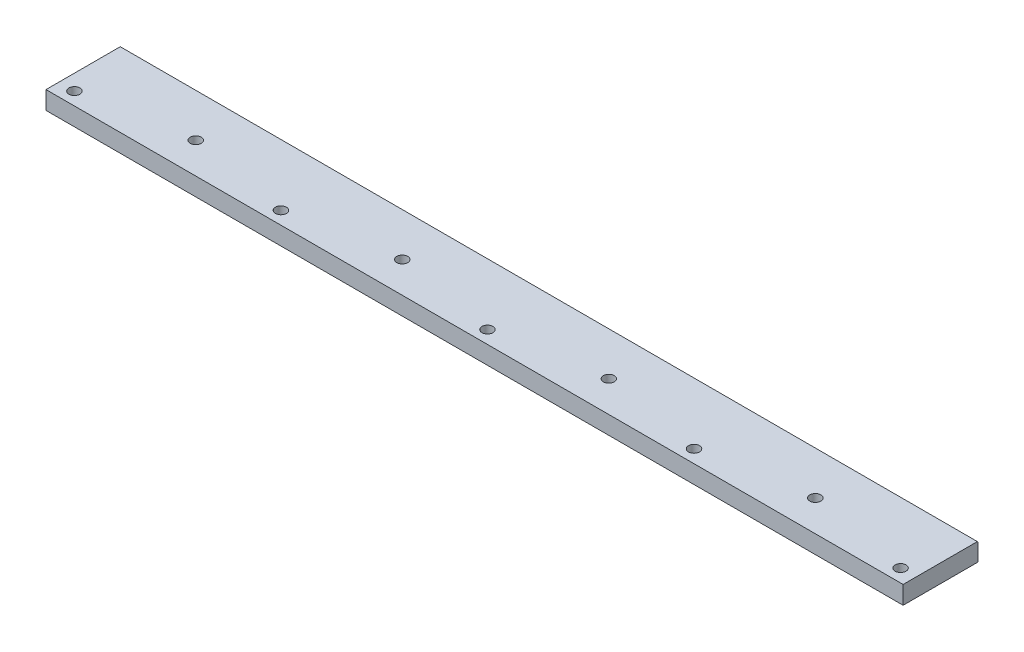
ISO-10303-21;
HEADER;
FILE_DESCRIPTION(('STEP AP214'),'2;1');
FILE_NAME('part.step','',(''),(''),'','','');
FILE_SCHEMA(('AUTOMOTIVE_DESIGN { 1 0 10303 214 1 1 1 1 }'));
ENDSEC;
DATA;
#1=APPLICATION_CONTEXT('core data for automotive mechanical design processes');
#2=APPLICATION_PROTOCOL_DEFINITION('international standard','automotive_design',2000,#1);
#3=PRODUCT_CONTEXT('',#1,'mechanical');
#4=PRODUCT('Part','Part','',(#3));
#5=PRODUCT_RELATED_PRODUCT_CATEGORY('part','',(#4));
#6=PRODUCT_DEFINITION_FORMATION('','',#4);
#7=PRODUCT_DEFINITION_CONTEXT('part definition',#1,'design');
#8=PRODUCT_DEFINITION('design','',#6,#7);
#9=PRODUCT_DEFINITION_SHAPE('','',#8);
#10=(LENGTH_UNIT() NAMED_UNIT(*) SI_UNIT(.MILLI.,.METRE.));
#11=(NAMED_UNIT(*) PLANE_ANGLE_UNIT() SI_UNIT($,.RADIAN.));
#12=(NAMED_UNIT(*) SI_UNIT($,.STERADIAN.) SOLID_ANGLE_UNIT());
#13=UNCERTAINTY_MEASURE_WITH_UNIT(LENGTH_MEASURE(1.E-05),#10,'distance_accuracy_value','');
#14=(GEOMETRIC_REPRESENTATION_CONTEXT(3) GLOBAL_UNCERTAINTY_ASSIGNED_CONTEXT((#13)) GLOBAL_UNIT_ASSIGNED_CONTEXT((#10,
#11,#12)) REPRESENTATION_CONTEXT('',''));
#15=CARTESIAN_POINT('',(0.,0.,0.));
#16=DIRECTION('',(0.,0.,1.));
#17=DIRECTION('',(1.,0.,0.));
#18=AXIS2_PLACEMENT_3D('',#15,#16,#17);
#19=CARTESIAN_POINT('',(1054.1,22.225,92.075));
#20=DIRECTION('',(-1.,0.,0.));
#21=DIRECTION('',(0.,0.,1.));
#22=AXIS2_PLACEMENT_3D('',#19,#20,#21);
#23=PLANE('',#22);
#24=DIRECTION('',(0.,-1.,0.));
#25=VECTOR('',#24,1.);
#26=CARTESIAN_POINT('',(1054.1,22.225,-92.075));
#27=LINE('',#26,#25);
#28=CARTESIAN_POINT('',(1054.1,20.7010000000001,-92.075));
#29=VERTEX_POINT('',#28);
#30=CARTESIAN_POINT('',(1054.1,-20.7010000000001,-92.075));
#31=VERTEX_POINT('',#30);
#32=EDGE_CURVE('E132',#29,#31,#27,.T.);
#33=ORIENTED_EDGE('',*,*,#32,.F.);
#34=DIRECTION('',(0.,-0.707106781186548,-0.707106781186548));
#35=VECTOR('',#34,1.);
#36=CARTESIAN_POINT('',(1054.1,22.225,-90.5510000000001));
#37=LINE('',#36,#35);
#38=CARTESIAN_POINT('',(1054.1,22.225,-90.5510000000001));
#39=VERTEX_POINT('',#38);
#40=EDGE_CURVE('E50',#29,#39,#37,.F.);
#41=ORIENTED_EDGE('',*,*,#40,.T.);
#42=DIRECTION('',(0.,0.,-1.));
#43=VECTOR('',#42,1.);
#44=CARTESIAN_POINT('',(1054.1,22.225,92.075));
#45=LINE('',#44,#43);
#46=CARTESIAN_POINT('',(1054.1,22.225,92.075));
#47=VERTEX_POINT('',#46);
#48=EDGE_CURVE('E106',#47,#39,#45,.T.);
#49=ORIENTED_EDGE('',*,*,#48,.F.);
#50=DIRECTION('',(0.,-1.,0.));
#51=VECTOR('',#50,1.);
#52=CARTESIAN_POINT('',(1054.1,22.225,92.075));
#53=LINE('',#52,#51);
#54=CARTESIAN_POINT('',(1054.1,-22.225,92.075));
#55=VERTEX_POINT('',#54);
#56=EDGE_CURVE('E115',#47,#55,#53,.T.);
#57=ORIENTED_EDGE('',*,*,#56,.T.);
#58=DIRECTION('',(0.,0.,-1.));
#59=VECTOR('',#58,1.);
#60=CARTESIAN_POINT('',(1054.1,-22.225,92.075));
#61=LINE('',#60,#59);
#62=CARTESIAN_POINT('',(1054.1,-22.225,-90.5510000000004));
#63=VERTEX_POINT('',#62);
#64=EDGE_CURVE('E124',#55,#63,#61,.T.);
#65=ORIENTED_EDGE('',*,*,#64,.T.);
#66=DIRECTION('',(0.,0.707106781186599,-0.707106781186496));
#67=VECTOR('',#66,1.);
#68=CARTESIAN_POINT('',(1054.1,-20.7010000000001,-92.075));
#69=LINE('',#68,#67);
#70=EDGE_CURVE('E62',#63,#31,#69,.T.);
#71=ORIENTED_EDGE('',*,*,#70,.T.);
#72=EDGE_LOOP('',(#33,#41,#49,#57,#65,#71));
#73=FACE_BOUND('',#72,.T.);
#74=ADVANCED_FACE('F41',(#73),#23,.F.);
#75=CARTESIAN_POINT('',(-1054.1,22.225,-92.075));
#76=DIRECTION('',(0.,0.,1.));
#77=DIRECTION('',(1.,0.,0.));
#78=AXIS2_PLACEMENT_3D('',#75,#76,#77);
#79=PLANE('',#78);
#80=DIRECTION('',(0.,-1.,0.));
#81=VECTOR('',#80,1.);
#82=CARTESIAN_POINT('',(-1054.1,22.225,-92.075));
#83=LINE('',#82,#81);
#84=CARTESIAN_POINT('',(-1054.1,20.7010000000001,-92.075));
#85=VERTEX_POINT('',#84);
#86=CARTESIAN_POINT('',(-1054.1,-20.7010000000001,-92.075));
#87=VERTEX_POINT('',#86);
#88=EDGE_CURVE('E114',#85,#87,#83,.T.);
#89=ORIENTED_EDGE('',*,*,#88,.F.);
#90=DIRECTION('',(1.,0.,0.));
#91=VECTOR('',#90,1.);
#92=CARTESIAN_POINT('',(-1054.1,20.7010000000001,-92.075));
#93=LINE('',#92,#91);
#94=EDGE_CURVE('E173',#85,#29,#93,.T.);
#95=ORIENTED_EDGE('',*,*,#94,.T.);
#96=ORIENTED_EDGE('',*,*,#32,.T.);
#97=DIRECTION('',(-1.,0.,0.));
#98=VECTOR('',#97,1.);
#99=CARTESIAN_POINT('',(-1054.1,-20.7010000000001,-92.075));
#100=LINE('',#99,#98);
#101=EDGE_CURVE('E170',#31,#87,#100,.T.);
#102=ORIENTED_EDGE('',*,*,#101,.T.);
#103=EDGE_LOOP('',(#89,#95,#96,#102));
#104=FACE_BOUND('',#103,.T.);
#105=ADVANCED_FACE('F181',(#104),#79,.F.);
#106=CARTESIAN_POINT('',(-1054.1,22.225,92.075));
#107=DIRECTION('',(1.,0.,0.));
#108=DIRECTION('',(0.,0.,-1.));
#109=AXIS2_PLACEMENT_3D('',#106,#107,#108);
#110=PLANE('',#109);
#111=DIRECTION('',(0.,0.,1.));
#112=VECTOR('',#111,1.);
#113=CARTESIAN_POINT('',(-1054.1,22.225,92.075));
#114=LINE('',#113,#112);
#115=CARTESIAN_POINT('',(-1054.1,22.225,-90.5510000000001));
#116=VERTEX_POINT('',#115);
#117=CARTESIAN_POINT('',(-1054.1,22.225,92.075));
#118=VERTEX_POINT('',#117);
#119=EDGE_CURVE('E96',#116,#118,#114,.T.);
#120=ORIENTED_EDGE('',*,*,#119,.F.);
#121=DIRECTION('',(0.,0.707106781186548,0.707106781186548));
#122=VECTOR('',#121,1.);
#123=CARTESIAN_POINT('',(-1054.1,22.225,-90.5510000000001));
#124=LINE('',#123,#122);
#125=EDGE_CURVE('E168',#116,#85,#124,.F.);
#126=ORIENTED_EDGE('',*,*,#125,.T.);
#127=ORIENTED_EDGE('',*,*,#88,.T.);
#128=DIRECTION('',(0.,-0.707106781186599,0.707106781186496));
#129=VECTOR('',#128,1.);
#130=CARTESIAN_POINT('',(-1054.1,-20.7010000000001,-92.075));
#131=LINE('',#130,#129);
#132=CARTESIAN_POINT('',(-1054.1,-22.225,-90.5510000000004));
#133=VERTEX_POINT('',#132);
#134=EDGE_CURVE('E166',#87,#133,#131,.T.);
#135=ORIENTED_EDGE('',*,*,#134,.T.);
#136=DIRECTION('',(0.,0.,1.));
#137=VECTOR('',#136,1.);
#138=CARTESIAN_POINT('',(-1054.1,-22.225,92.075));
#139=LINE('',#138,#137);
#140=CARTESIAN_POINT('',(-1054.1,-22.225,92.075));
#141=VERTEX_POINT('',#140);
#142=EDGE_CURVE('E111',#133,#141,#139,.T.);
#143=ORIENTED_EDGE('',*,*,#142,.T.);
#144=DIRECTION('',(0.,-1.,0.));
#145=VECTOR('',#144,1.);
#146=CARTESIAN_POINT('',(-1054.1,22.225,92.075));
#147=LINE('',#146,#145);
#148=EDGE_CURVE('E109',#118,#141,#147,.T.);
#149=ORIENTED_EDGE('',*,*,#148,.F.);
#150=EDGE_LOOP('',(#120,#126,#127,#135,#143,#149));
#151=FACE_BOUND('',#150,.T.);
#152=ADVANCED_FACE('F110',(#151),#110,.F.);
#153=CARTESIAN_POINT('',(-1054.1,22.225,92.075));
#154=DIRECTION('',(0.,0.,-1.));
#155=DIRECTION('',(-1.,0.,0.));
#156=AXIS2_PLACEMENT_3D('',#153,#154,#155);
#157=PLANE('',#156);
#158=DIRECTION('',(1.,0.,0.));
#159=VECTOR('',#158,1.);
#160=CARTESIAN_POINT('',(-1054.1,-22.225,92.075));
#161=LINE('',#160,#159);
#162=EDGE_CURVE('E128',#141,#55,#161,.T.);
#163=ORIENTED_EDGE('',*,*,#162,.T.);
#164=ORIENTED_EDGE('',*,*,#56,.F.);
#165=DIRECTION('',(1.,0.,0.));
#166=VECTOR('',#165,1.);
#167=CARTESIAN_POINT('',(-1054.1,22.225,92.075));
#168=LINE('',#167,#166);
#169=EDGE_CURVE('E101',#118,#47,#168,.T.);
#170=ORIENTED_EDGE('',*,*,#169,.F.);
#171=ORIENTED_EDGE('',*,*,#148,.T.);
#172=EDGE_LOOP('',(#163,#164,#170,#171));
#173=FACE_BOUND('',#172,.T.);
#174=ADVANCED_FACE('F117',(#173),#157,.F.);
#175=CARTESIAN_POINT('',(0.,22.225,0.));
#176=DIRECTION('',(0.,-1.,0.));
#177=DIRECTION('',(0.,0.,-1.));
#178=AXIS2_PLACEMENT_3D('',#175,#176,#177);
#179=PLANE('',#178);
#180=CARTESIAN_POINT('',(-762.,22.225,15.875));
#181=DIRECTION('',(0.,-1.,0.));
#182=DIRECTION('',(0.,0.,-1.));
#183=AXIS2_PLACEMENT_3D('',#180,#181,#182);
#184=CIRCLE('',#183,13.4874);
#185=CARTESIAN_POINT('',(-762.,22.225,2.38759999999996));
#186=VERTEX_POINT('',#185);
#187=EDGE_CURVE('E336',#186,#186,#184,.F.);
#188=ORIENTED_EDGE('',*,*,#187,.F.);
#189=EDGE_LOOP('',(#188));
#190=FACE_BOUND('',#189,.T.);
#191=CARTESIAN_POINT('',(-254.,22.225,15.875));
#192=DIRECTION('',(0.,-1.,0.));
#193=DIRECTION('',(0.,0.,-1.));
#194=AXIS2_PLACEMENT_3D('',#191,#192,#193);
#195=CIRCLE('',#194,13.4874);
#196=CARTESIAN_POINT('',(-254.,22.225,2.38759999999999));
#197=VERTEX_POINT('',#196);
#198=EDGE_CURVE('E364',#197,#197,#195,.F.);
#199=ORIENTED_EDGE('',*,*,#198,.F.);
#200=EDGE_LOOP('',(#199));
#201=FACE_BOUND('',#200,.T.);
#202=CARTESIAN_POINT('',(254.,22.225,15.875));
#203=DIRECTION('',(0.,-1.,0.));
#204=DIRECTION('',(0.,0.,-1.));
#205=AXIS2_PLACEMENT_3D('',#202,#203,#204);
#206=CIRCLE('',#205,13.4874);
#207=CARTESIAN_POINT('',(254.,22.225,2.38760000000002));
#208=VERTEX_POINT('',#207);
#209=EDGE_CURVE('E367',#208,#208,#206,.F.);
#210=ORIENTED_EDGE('',*,*,#209,.F.);
#211=EDGE_LOOP('',(#210));
#212=FACE_BOUND('',#211,.T.);
#213=CARTESIAN_POINT('',(762.,22.225,15.875));
#214=DIRECTION('',(0.,-1.,0.));
#215=DIRECTION('',(0.,0.,-1.));
#216=AXIS2_PLACEMENT_3D('',#213,#214,#215);
#217=CIRCLE('',#216,13.4874);
#218=CARTESIAN_POINT('',(762.,22.225,2.38759999999996));
#219=VERTEX_POINT('',#218);
#220=EDGE_CURVE('E164',#219,#219,#217,.F.);
#221=ORIENTED_EDGE('',*,*,#220,.F.);
#222=EDGE_LOOP('',(#221));
#223=FACE_BOUND('',#222,.T.);
#224=CARTESIAN_POINT('',(-1016.,22.225,60.325));
#225=DIRECTION('',(0.,-1.,0.));
#226=DIRECTION('',(0.,0.,-1.));
#227=AXIS2_PLACEMENT_3D('',#224,#225,#226);
#228=CIRCLE('',#227,13.4874);
#229=CARTESIAN_POINT('',(-1016.,22.225,46.8376));
#230=VERTEX_POINT('',#229);
#231=EDGE_CURVE('E126',#230,#230,#228,.F.);
#232=ORIENTED_EDGE('',*,*,#231,.F.);
#233=EDGE_LOOP('',(#232));
#234=FACE_BOUND('',#233,.T.);
#235=CARTESIAN_POINT('',(-508.,22.225,60.325));
#236=DIRECTION('',(0.,-1.,0.));
#237=DIRECTION('',(0.,0.,-1.));
#238=AXIS2_PLACEMENT_3D('',#235,#236,#237);
#239=CIRCLE('',#238,13.4874);
#240=CARTESIAN_POINT('',(-508.,22.225,46.8376));
#241=VERTEX_POINT('',#240);
#242=EDGE_CURVE('E311',#241,#241,#239,.F.);
#243=ORIENTED_EDGE('',*,*,#242,.F.);
#244=EDGE_LOOP('',(#243));
#245=FACE_BOUND('',#244,.T.);
#246=CARTESIAN_POINT('',(0.,22.225,60.325));
#247=DIRECTION('',(0.,-1.,0.));
#248=DIRECTION('',(0.,0.,-1.));
#249=AXIS2_PLACEMENT_3D('',#246,#247,#248);
#250=CIRCLE('',#249,13.4874);
#251=CARTESIAN_POINT('',(0.,22.225,46.8376));
#252=VERTEX_POINT('',#251);
#253=EDGE_CURVE('E308',#252,#252,#250,.F.);
#254=ORIENTED_EDGE('',*,*,#253,.F.);
#255=EDGE_LOOP('',(#254));
#256=FACE_BOUND('',#255,.T.);
#257=CARTESIAN_POINT('',(508.,22.225,60.325));
#258=DIRECTION('',(0.,-1.,0.));
#259=DIRECTION('',(0.,0.,-1.));
#260=AXIS2_PLACEMENT_3D('',#257,#258,#259);
#261=CIRCLE('',#260,13.4874);
#262=CARTESIAN_POINT('',(508.,22.225,46.8376));
#263=VERTEX_POINT('',#262);
#264=EDGE_CURVE('E306',#263,#263,#261,.F.);
#265=ORIENTED_EDGE('',*,*,#264,.F.);
#266=EDGE_LOOP('',(#265));
#267=FACE_BOUND('',#266,.T.);
#268=CARTESIAN_POINT('',(1016.,22.225,60.325));
#269=DIRECTION('',(0.,-1.,0.));
#270=DIRECTION('',(0.,0.,-1.));
#271=AXIS2_PLACEMENT_3D('',#268,#269,#270);
#272=CIRCLE('',#271,13.4874);
#273=CARTESIAN_POINT('',(1016.,22.225,46.8376));
#274=VERTEX_POINT('',#273);
#275=EDGE_CURVE('E150',#274,#274,#272,.F.);
#276=ORIENTED_EDGE('',*,*,#275,.F.);
#277=EDGE_LOOP('',(#276));
#278=FACE_BOUND('',#277,.T.);
#279=ORIENTED_EDGE('',*,*,#48,.T.);
#280=DIRECTION('',(-1.,0.,0.));
#281=VECTOR('',#280,1.);
#282=CARTESIAN_POINT('',(0.,22.225,-90.5510000000001));
#283=LINE('',#282,#281);
#284=EDGE_CURVE('E104',#39,#116,#283,.T.);
#285=ORIENTED_EDGE('',*,*,#284,.T.);
#286=ORIENTED_EDGE('',*,*,#119,.T.);
#287=ORIENTED_EDGE('',*,*,#169,.T.);
#288=EDGE_LOOP('',(#279,#285,#286,#287));
#289=FACE_BOUND('',#288,.T.);
#290=ADVANCED_FACE('F99',(#190,#201,#212,#223,#234,#245,#256,#267,#278,#289),#179,.F.);
#291=CARTESIAN_POINT('',(0.,-22.225,0.));
#292=DIRECTION('',(0.,-1.,0.));
#293=DIRECTION('',(0.,0.,-1.));
#294=AXIS2_PLACEMENT_3D('',#291,#292,#293);
#295=PLANE('',#294);
#296=CARTESIAN_POINT('',(-762.,-22.225,15.875));
#297=DIRECTION('',(0.,1.,0.));
#298=DIRECTION('',(0.,0.,1.));
#299=AXIS2_PLACEMENT_3D('',#296,#297,#298);
#300=CIRCLE('',#299,19.8374);
#301=CARTESIAN_POINT('',(-762.,-22.225,35.7124));
#302=VERTEX_POINT('',#301);
#303=EDGE_CURVE('E390',#302,#302,#300,.T.);
#304=ORIENTED_EDGE('',*,*,#303,.T.);
#305=EDGE_LOOP('',(#304));
#306=FACE_BOUND('',#305,.T.);
#307=CARTESIAN_POINT('',(-254.,-22.225,15.875));
#308=DIRECTION('',(0.,1.,0.));
#309=DIRECTION('',(0.,0.,1.));
#310=AXIS2_PLACEMENT_3D('',#307,#308,#309);
#311=CIRCLE('',#310,19.8374);
#312=CARTESIAN_POINT('',(-254.,-22.225,35.7124));
#313=VERTEX_POINT('',#312);
#314=EDGE_CURVE('E387',#313,#313,#311,.T.);
#315=ORIENTED_EDGE('',*,*,#314,.T.);
#316=EDGE_LOOP('',(#315));
#317=FACE_BOUND('',#316,.T.);
#318=CARTESIAN_POINT('',(254.,-22.225,15.875));
#319=DIRECTION('',(0.,1.,0.));
#320=DIRECTION('',(0.,0.,1.));
#321=AXIS2_PLACEMENT_3D('',#318,#319,#320);
#322=CIRCLE('',#321,19.8374);
#323=CARTESIAN_POINT('',(254.,-22.225,35.7124));
#324=VERTEX_POINT('',#323);
#325=EDGE_CURVE('E381',#324,#324,#322,.T.);
#326=ORIENTED_EDGE('',*,*,#325,.T.);
#327=EDGE_LOOP('',(#326));
#328=FACE_BOUND('',#327,.T.);
#329=CARTESIAN_POINT('',(762.,-22.225,15.875));
#330=DIRECTION('',(0.,1.,0.));
#331=DIRECTION('',(0.,0.,1.));
#332=AXIS2_PLACEMENT_3D('',#329,#330,#331);
#333=CIRCLE('',#332,19.8374);
#334=CARTESIAN_POINT('',(762.,-22.225,35.7124));
#335=VERTEX_POINT('',#334);
#336=EDGE_CURVE('E375',#335,#335,#333,.T.);
#337=ORIENTED_EDGE('',*,*,#336,.T.);
#338=EDGE_LOOP('',(#337));
#339=FACE_BOUND('',#338,.T.);
#340=CARTESIAN_POINT('',(-1016.,-22.225,60.325));
#341=DIRECTION('',(0.,1.,0.));
#342=DIRECTION('',(0.,0.,1.));
#343=AXIS2_PLACEMENT_3D('',#340,#341,#342);
#344=CIRCLE('',#343,19.8374);
#345=CARTESIAN_POINT('',(-1016.,-22.225,80.1624));
#346=VERTEX_POINT('',#345);
#347=EDGE_CURVE('E357',#346,#346,#344,.T.);
#348=ORIENTED_EDGE('',*,*,#347,.T.);
#349=EDGE_LOOP('',(#348));
#350=FACE_BOUND('',#349,.T.);
#351=CARTESIAN_POINT('',(-508.,-22.225,60.325));
#352=DIRECTION('',(0.,1.,0.));
#353=DIRECTION('',(0.,0.,1.));
#354=AXIS2_PLACEMENT_3D('',#351,#352,#353);
#355=CIRCLE('',#354,19.8374);
#356=CARTESIAN_POINT('',(-508.,-22.225,80.1624));
#357=VERTEX_POINT('',#356);
#358=EDGE_CURVE('E354',#357,#357,#355,.T.);
#359=ORIENTED_EDGE('',*,*,#358,.T.);
#360=EDGE_LOOP('',(#359));
#361=FACE_BOUND('',#360,.T.);
#362=CARTESIAN_POINT('',(0.,-22.225,60.325));
#363=DIRECTION('',(0.,1.,0.));
#364=DIRECTION('',(0.,0.,1.));
#365=AXIS2_PLACEMENT_3D('',#362,#363,#364);
#366=CIRCLE('',#365,19.8374);
#367=CARTESIAN_POINT('',(0.,-22.225,80.1624));
#368=VERTEX_POINT('',#367);
#369=EDGE_CURVE('E348',#368,#368,#366,.T.);
#370=ORIENTED_EDGE('',*,*,#369,.T.);
#371=EDGE_LOOP('',(#370));
#372=FACE_BOUND('',#371,.T.);
#373=CARTESIAN_POINT('',(508.,-22.225,60.325));
#374=DIRECTION('',(0.,1.,0.));
#375=DIRECTION('',(0.,0.,1.));
#376=AXIS2_PLACEMENT_3D('',#373,#374,#375);
#377=CIRCLE('',#376,19.8374);
#378=CARTESIAN_POINT('',(508.,-22.225,80.1624));
#379=VERTEX_POINT('',#378);
#380=EDGE_CURVE('E342',#379,#379,#377,.T.);
#381=ORIENTED_EDGE('',*,*,#380,.T.);
#382=EDGE_LOOP('',(#381));
#383=FACE_BOUND('',#382,.T.);
#384=CARTESIAN_POINT('',(1016.,-22.225,60.325));
#385=DIRECTION('',(0.,1.,0.));
#386=DIRECTION('',(0.,0.,1.));
#387=AXIS2_PLACEMENT_3D('',#384,#385,#386);
#388=CIRCLE('',#387,19.8373999999999);
#389=CARTESIAN_POINT('',(1016.,-22.225,80.1623999999999));
#390=VERTEX_POINT('',#389);
#391=EDGE_CURVE('E335',#390,#390,#388,.T.);
#392=ORIENTED_EDGE('',*,*,#391,.T.);
#393=EDGE_LOOP('',(#392));
#394=FACE_BOUND('',#393,.T.);
#395=ORIENTED_EDGE('',*,*,#142,.F.);
#396=DIRECTION('',(1.,0.,0.));
#397=VECTOR('',#396,1.);
#398=CARTESIAN_POINT('',(1054.1,-22.225,-90.5510000000004));
#399=LINE('',#398,#397);
#400=EDGE_CURVE('E11',#133,#63,#399,.T.);
#401=ORIENTED_EDGE('',*,*,#400,.T.);
#402=ORIENTED_EDGE('',*,*,#64,.F.);
#403=ORIENTED_EDGE('',*,*,#162,.F.);
#404=EDGE_LOOP('',(#395,#401,#402,#403));
#405=FACE_BOUND('',#404,.T.);
#406=ADVANCED_FACE('F184',(#306,#317,#328,#339,#350,#361,#372,#383,#394,#405),#295,.T.);
#407=CARTESIAN_POINT('',(1016.,66.675,60.325));
#408=DIRECTION('',(0.,-1.,0.));
#409=DIRECTION('',(0.,0.,-1.));
#410=AXIS2_PLACEMENT_3D('',#407,#408,#409);
#411=CYLINDRICAL_SURFACE('',#410,13.4874);
#412=CARTESIAN_POINT('',(1016.,3.175,60.325));
#413=DIRECTION('',(0.,1.,0.));
#414=DIRECTION('',(0.,0.,1.));
#415=AXIS2_PLACEMENT_3D('',#412,#413,#414);
#416=CIRCLE('',#415,13.4874);
#417=CARTESIAN_POINT('',(1016.,3.175,73.8124));
#418=VERTEX_POINT('',#417);
#419=EDGE_CURVE('E147',#418,#418,#416,.T.);
#420=ORIENTED_EDGE('',*,*,#419,.F.);
#421=EDGE_LOOP('',(#420));
#422=FACE_BOUND('',#421,.T.);
#423=ORIENTED_EDGE('',*,*,#275,.T.);
#424=EDGE_LOOP('',(#423));
#425=FACE_BOUND('',#424,.T.);
#426=ADVANCED_FACE('F186',(#422,#425),#411,.F.);
#427=CARTESIAN_POINT('',(508.,66.675,60.325));
#428=DIRECTION('',(0.,-1.,0.));
#429=DIRECTION('',(0.,0.,-1.));
#430=AXIS2_PLACEMENT_3D('',#427,#428,#429);
#431=CYLINDRICAL_SURFACE('',#430,13.4874);
#432=CARTESIAN_POINT('',(508.,3.175,60.325));
#433=DIRECTION('',(0.,1.,0.));
#434=DIRECTION('',(0.,0.,1.));
#435=AXIS2_PLACEMENT_3D('',#432,#433,#434);
#436=CIRCLE('',#435,13.4874);
#437=CARTESIAN_POINT('',(508.,3.175,73.8124));
#438=VERTEX_POINT('',#437);
#439=EDGE_CURVE('E144',#438,#438,#436,.T.);
#440=ORIENTED_EDGE('',*,*,#439,.F.);
#441=EDGE_LOOP('',(#440));
#442=FACE_BOUND('',#441,.T.);
#443=ORIENTED_EDGE('',*,*,#264,.T.);
#444=EDGE_LOOP('',(#443));
#445=FACE_BOUND('',#444,.T.);
#446=ADVANCED_FACE('F194',(#442,#445),#431,.F.);
#447=CARTESIAN_POINT('',(0.,66.675,60.325));
#448=DIRECTION('',(0.,-1.,0.));
#449=DIRECTION('',(0.,0.,-1.));
#450=AXIS2_PLACEMENT_3D('',#447,#448,#449);
#451=CYLINDRICAL_SURFACE('',#450,13.4874);
#452=CARTESIAN_POINT('',(0.,3.175,60.325));
#453=DIRECTION('',(0.,1.,0.));
#454=DIRECTION('',(0.,0.,1.));
#455=AXIS2_PLACEMENT_3D('',#452,#453,#454);
#456=CIRCLE('',#455,13.4874);
#457=CARTESIAN_POINT('',(0.,3.175,73.8124));
#458=VERTEX_POINT('',#457);
#459=EDGE_CURVE('E141',#458,#458,#456,.T.);
#460=ORIENTED_EDGE('',*,*,#459,.F.);
#461=EDGE_LOOP('',(#460));
#462=FACE_BOUND('',#461,.T.);
#463=ORIENTED_EDGE('',*,*,#253,.T.);
#464=EDGE_LOOP('',(#463));
#465=FACE_BOUND('',#464,.T.);
#466=ADVANCED_FACE('F293',(#462,#465),#451,.F.);
#467=CARTESIAN_POINT('',(-508.,66.675,60.325));
#468=DIRECTION('',(0.,-1.,0.));
#469=DIRECTION('',(0.,0.,-1.));
#470=AXIS2_PLACEMENT_3D('',#467,#468,#469);
#471=CYLINDRICAL_SURFACE('',#470,13.4874);
#472=CARTESIAN_POINT('',(-508.,3.175,60.325));
#473=DIRECTION('',(0.,1.,0.));
#474=DIRECTION('',(0.,0.,1.));
#475=AXIS2_PLACEMENT_3D('',#472,#473,#474);
#476=CIRCLE('',#475,13.4874);
#477=CARTESIAN_POINT('',(-508.,3.175,73.8124));
#478=VERTEX_POINT('',#477);
#479=EDGE_CURVE('E137',#478,#478,#476,.T.);
#480=ORIENTED_EDGE('',*,*,#479,.F.);
#481=EDGE_LOOP('',(#480));
#482=FACE_BOUND('',#481,.T.);
#483=ORIENTED_EDGE('',*,*,#242,.T.);
#484=EDGE_LOOP('',(#483));
#485=FACE_BOUND('',#484,.T.);
#486=ADVANCED_FACE('F289',(#482,#485),#471,.F.);
#487=CARTESIAN_POINT('',(-1016.,66.675,60.325));
#488=DIRECTION('',(0.,-1.,0.));
#489=DIRECTION('',(0.,0.,-1.));
#490=AXIS2_PLACEMENT_3D('',#487,#488,#489);
#491=CYLINDRICAL_SURFACE('',#490,13.4874);
#492=CARTESIAN_POINT('',(-1016.,3.175,60.325));
#493=DIRECTION('',(0.,1.,0.));
#494=DIRECTION('',(0.,0.,1.));
#495=AXIS2_PLACEMENT_3D('',#492,#493,#494);
#496=CIRCLE('',#495,13.4874);
#497=CARTESIAN_POINT('',(-1016.,3.175,73.8124));
#498=VERTEX_POINT('',#497);
#499=EDGE_CURVE('E134',#498,#498,#496,.T.);
#500=ORIENTED_EDGE('',*,*,#499,.F.);
#501=EDGE_LOOP('',(#500));
#502=FACE_BOUND('',#501,.T.);
#503=ORIENTED_EDGE('',*,*,#231,.T.);
#504=EDGE_LOOP('',(#503));
#505=FACE_BOUND('',#504,.T.);
#506=ADVANCED_FACE('F255',(#502,#505),#491,.F.);
#507=CARTESIAN_POINT('',(-1016.,3.175,60.325));
#508=DIRECTION('',(0.,-1.,0.));
#509=DIRECTION('',(0.,0.,-1.));
#510=AXIS2_PLACEMENT_3D('',#507,#508,#509);
#511=CYLINDRICAL_SURFACE('',#510,19.8374);
#512=CARTESIAN_POINT('',(-1016.,3.175,60.325));
#513=DIRECTION('',(0.,1.,0.));
#514=DIRECTION('',(0.,0.,1.));
#515=AXIS2_PLACEMENT_3D('',#512,#513,#514);
#516=CIRCLE('',#515,19.8374);
#517=CARTESIAN_POINT('',(-1016.,3.175,80.1624));
#518=VERTEX_POINT('',#517);
#519=EDGE_CURVE('E138',#518,#518,#516,.T.);
#520=ORIENTED_EDGE('',*,*,#519,.T.);
#521=EDGE_LOOP('',(#520));
#522=FACE_BOUND('',#521,.T.);
#523=ORIENTED_EDGE('',*,*,#347,.F.);
#524=EDGE_LOOP('',(#523));
#525=FACE_BOUND('',#524,.T.);
#526=ADVANCED_FACE('F251',(#522,#525),#511,.F.);
#527=CARTESIAN_POINT('',(-1016.,3.175,60.325));
#528=DIRECTION('',(0.,1.,0.));
#529=DIRECTION('',(0.,0.,1.));
#530=AXIS2_PLACEMENT_3D('',#527,#528,#529);
#531=PLANE('',#530);
#532=ORIENTED_EDGE('',*,*,#499,.T.);
#533=EDGE_LOOP('',(#532));
#534=FACE_BOUND('',#533,.T.);
#535=ORIENTED_EDGE('',*,*,#519,.F.);
#536=EDGE_LOOP('',(#535));
#537=FACE_BOUND('',#536,.T.);
#538=ADVANCED_FACE('F247',(#534,#537),#531,.F.);
#539=CARTESIAN_POINT('',(-508.,3.175,60.325));
#540=DIRECTION('',(0.,-1.,0.));
#541=DIRECTION('',(0.,0.,-1.));
#542=AXIS2_PLACEMENT_3D('',#539,#540,#541);
#543=CYLINDRICAL_SURFACE('',#542,19.8374);
#544=CARTESIAN_POINT('',(-508.,3.175,60.325));
#545=DIRECTION('',(0.,1.,0.));
#546=DIRECTION('',(0.,0.,1.));
#547=AXIS2_PLACEMENT_3D('',#544,#545,#546);
#548=CIRCLE('',#547,19.8374);
#549=CARTESIAN_POINT('',(-508.,3.175,80.1624));
#550=VERTEX_POINT('',#549);
#551=EDGE_CURVE('E351',#550,#550,#548,.T.);
#552=ORIENTED_EDGE('',*,*,#551,.T.);
#553=EDGE_LOOP('',(#552));
#554=FACE_BOUND('',#553,.T.);
#555=ORIENTED_EDGE('',*,*,#358,.F.);
#556=EDGE_LOOP('',(#555));
#557=FACE_BOUND('',#556,.T.);
#558=ADVANCED_FACE('F250',(#554,#557),#543,.F.);
#559=CARTESIAN_POINT('',(-508.,3.175,60.325));
#560=DIRECTION('',(0.,1.,0.));
#561=DIRECTION('',(0.,0.,1.));
#562=AXIS2_PLACEMENT_3D('',#559,#560,#561);
#563=PLANE('',#562);
#564=ORIENTED_EDGE('',*,*,#479,.T.);
#565=EDGE_LOOP('',(#564));
#566=FACE_BOUND('',#565,.T.);
#567=ORIENTED_EDGE('',*,*,#551,.F.);
#568=EDGE_LOOP('',(#567));
#569=FACE_BOUND('',#568,.T.);
#570=ADVANCED_FACE('F259',(#566,#569),#563,.F.);
#571=CARTESIAN_POINT('',(0.,3.175,60.325));
#572=DIRECTION('',(0.,-1.,0.));
#573=DIRECTION('',(0.,0.,-1.));
#574=AXIS2_PLACEMENT_3D('',#571,#572,#573);
#575=CYLINDRICAL_SURFACE('',#574,19.8374);
#576=CARTESIAN_POINT('',(0.,3.175,60.325));
#577=DIRECTION('',(0.,1.,0.));
#578=DIRECTION('',(0.,0.,1.));
#579=AXIS2_PLACEMENT_3D('',#576,#577,#578);
#580=CIRCLE('',#579,19.8374);
#581=CARTESIAN_POINT('',(0.,3.175,80.1624));
#582=VERTEX_POINT('',#581);
#583=EDGE_CURVE('E345',#582,#582,#580,.T.);
#584=ORIENTED_EDGE('',*,*,#583,.T.);
#585=EDGE_LOOP('',(#584));
#586=FACE_BOUND('',#585,.T.);
#587=ORIENTED_EDGE('',*,*,#369,.F.);
#588=EDGE_LOOP('',(#587));
#589=FACE_BOUND('',#588,.T.);
#590=ADVANCED_FACE('F263',(#586,#589),#575,.F.);
#591=CARTESIAN_POINT('',(0.,3.175,60.325));
#592=DIRECTION('',(0.,1.,0.));
#593=DIRECTION('',(0.,0.,1.));
#594=AXIS2_PLACEMENT_3D('',#591,#592,#593);
#595=PLANE('',#594);
#596=ORIENTED_EDGE('',*,*,#459,.T.);
#597=EDGE_LOOP('',(#596));
#598=FACE_BOUND('',#597,.T.);
#599=ORIENTED_EDGE('',*,*,#583,.F.);
#600=EDGE_LOOP('',(#599));
#601=FACE_BOUND('',#600,.T.);
#602=ADVANCED_FACE('F267',(#598,#601),#595,.F.);
#603=CARTESIAN_POINT('',(508.,3.175,60.325));
#604=DIRECTION('',(0.,-1.,0.));
#605=DIRECTION('',(0.,0.,-1.));
#606=AXIS2_PLACEMENT_3D('',#603,#604,#605);
#607=CYLINDRICAL_SURFACE('',#606,19.8374);
#608=CARTESIAN_POINT('',(508.,3.175,60.325));
#609=DIRECTION('',(0.,1.,0.));
#610=DIRECTION('',(0.,0.,1.));
#611=AXIS2_PLACEMENT_3D('',#608,#609,#610);
#612=CIRCLE('',#611,19.8374);
#613=CARTESIAN_POINT('',(508.,3.175,80.1624));
#614=VERTEX_POINT('',#613);
#615=EDGE_CURVE('E339',#614,#614,#612,.T.);
#616=ORIENTED_EDGE('',*,*,#615,.T.);
#617=EDGE_LOOP('',(#616));
#618=FACE_BOUND('',#617,.T.);
#619=ORIENTED_EDGE('',*,*,#380,.F.);
#620=EDGE_LOOP('',(#619));
#621=FACE_BOUND('',#620,.T.);
#622=ADVANCED_FACE('F271',(#618,#621),#607,.F.);
#623=CARTESIAN_POINT('',(508.,3.175,60.325));
#624=DIRECTION('',(0.,1.,0.));
#625=DIRECTION('',(0.,0.,1.));
#626=AXIS2_PLACEMENT_3D('',#623,#624,#625);
#627=PLANE('',#626);
#628=ORIENTED_EDGE('',*,*,#439,.T.);
#629=EDGE_LOOP('',(#628));
#630=FACE_BOUND('',#629,.T.);
#631=ORIENTED_EDGE('',*,*,#615,.F.);
#632=EDGE_LOOP('',(#631));
#633=FACE_BOUND('',#632,.T.);
#634=ADVANCED_FACE('F275',(#630,#633),#627,.F.);
#635=CARTESIAN_POINT('',(1016.,3.175,60.325));
#636=DIRECTION('',(0.,-1.,0.));
#637=DIRECTION('',(0.,0.,-1.));
#638=AXIS2_PLACEMENT_3D('',#635,#636,#637);
#639=CYLINDRICAL_SURFACE('',#638,19.8373999999999);
#640=CARTESIAN_POINT('',(1016.,3.175,60.325));
#641=DIRECTION('',(0.,1.,0.));
#642=DIRECTION('',(0.,0.,1.));
#643=AXIS2_PLACEMENT_3D('',#640,#641,#642);
#644=CIRCLE('',#643,19.8373999999999);
#645=CARTESIAN_POINT('',(1016.,3.175,80.1623999999999));
#646=VERTEX_POINT('',#645);
#647=EDGE_CURVE('E332',#646,#646,#644,.T.);
#648=ORIENTED_EDGE('',*,*,#647,.T.);
#649=EDGE_LOOP('',(#648));
#650=FACE_BOUND('',#649,.T.);
#651=ORIENTED_EDGE('',*,*,#391,.F.);
#652=EDGE_LOOP('',(#651));
#653=FACE_BOUND('',#652,.T.);
#654=ADVANCED_FACE('F279',(#650,#653),#639,.F.);
#655=CARTESIAN_POINT('',(1016.,3.175,60.325));
#656=DIRECTION('',(0.,1.,0.));
#657=DIRECTION('',(0.,0.,1.));
#658=AXIS2_PLACEMENT_3D('',#655,#656,#657);
#659=PLANE('',#658);
#660=ORIENTED_EDGE('',*,*,#419,.T.);
#661=EDGE_LOOP('',(#660));
#662=FACE_BOUND('',#661,.T.);
#663=ORIENTED_EDGE('',*,*,#647,.F.);
#664=EDGE_LOOP('',(#663));
#665=FACE_BOUND('',#664,.T.);
#666=ADVANCED_FACE('F245',(#662,#665),#659,.F.);
#667=CARTESIAN_POINT('',(762.,66.675,15.875));
#668=DIRECTION('',(0.,-1.,0.));
#669=DIRECTION('',(0.,0.,-1.));
#670=AXIS2_PLACEMENT_3D('',#667,#668,#669);
#671=CYLINDRICAL_SURFACE('',#670,13.4874);
#672=CARTESIAN_POINT('',(762.,3.175,15.875));
#673=DIRECTION('',(0.,1.,0.));
#674=DIRECTION('',(0.,0.,1.));
#675=AXIS2_PLACEMENT_3D('',#672,#673,#674);
#676=CIRCLE('',#675,13.4874);
#677=CARTESIAN_POINT('',(762.,3.175,29.3624));
#678=VERTEX_POINT('',#677);
#679=EDGE_CURVE('E161',#678,#678,#676,.T.);
#680=ORIENTED_EDGE('',*,*,#679,.F.);
#681=EDGE_LOOP('',(#680));
#682=FACE_BOUND('',#681,.T.);
#683=ORIENTED_EDGE('',*,*,#220,.T.);
#684=EDGE_LOOP('',(#683));
#685=FACE_BOUND('',#684,.T.);
#686=ADVANCED_FACE('F241',(#682,#685),#671,.F.);
#687=CARTESIAN_POINT('',(254.,66.675,15.875));
#688=DIRECTION('',(0.,-1.,0.));
#689=DIRECTION('',(0.,0.,-1.));
#690=AXIS2_PLACEMENT_3D('',#687,#688,#689);
#691=CYLINDRICAL_SURFACE('',#690,13.4874);
#692=CARTESIAN_POINT('',(254.,3.175,15.875));
#693=DIRECTION('',(0.,1.,0.));
#694=DIRECTION('',(0.,0.,1.));
#695=AXIS2_PLACEMENT_3D('',#692,#693,#694);
#696=CIRCLE('',#695,13.4874);
#697=CARTESIAN_POINT('',(254.,3.175,29.3624));
#698=VERTEX_POINT('',#697);
#699=EDGE_CURVE('E158',#698,#698,#696,.T.);
#700=ORIENTED_EDGE('',*,*,#699,.F.);
#701=EDGE_LOOP('',(#700));
#702=FACE_BOUND('',#701,.T.);
#703=ORIENTED_EDGE('',*,*,#209,.T.);
#704=EDGE_LOOP('',(#703));
#705=FACE_BOUND('',#704,.T.);
#706=ADVANCED_FACE('F237',(#702,#705),#691,.F.);
#707=CARTESIAN_POINT('',(-254.,66.675,15.875));
#708=DIRECTION('',(0.,-1.,0.));
#709=DIRECTION('',(0.,0.,-1.));
#710=AXIS2_PLACEMENT_3D('',#707,#708,#709);
#711=CYLINDRICAL_SURFACE('',#710,13.4874);
#712=CARTESIAN_POINT('',(-254.,3.175,15.875));
#713=DIRECTION('',(0.,1.,0.));
#714=DIRECTION('',(0.,0.,1.));
#715=AXIS2_PLACEMENT_3D('',#712,#713,#714);
#716=CIRCLE('',#715,13.4874);
#717=CARTESIAN_POINT('',(-254.,3.175,29.3624));
#718=VERTEX_POINT('',#717);
#719=EDGE_CURVE('E154',#718,#718,#716,.T.);
#720=ORIENTED_EDGE('',*,*,#719,.F.);
#721=EDGE_LOOP('',(#720));
#722=FACE_BOUND('',#721,.T.);
#723=ORIENTED_EDGE('',*,*,#198,.T.);
#724=EDGE_LOOP('',(#723));
#725=FACE_BOUND('',#724,.T.);
#726=ADVANCED_FACE('F233',(#722,#725),#711,.F.);
#727=CARTESIAN_POINT('',(-762.,66.675,15.875));
#728=DIRECTION('',(0.,-1.,0.));
#729=DIRECTION('',(0.,0.,-1.));
#730=AXIS2_PLACEMENT_3D('',#727,#728,#729);
#731=CYLINDRICAL_SURFACE('',#730,13.4874);
#732=CARTESIAN_POINT('',(-762.,3.175,15.875));
#733=DIRECTION('',(0.,1.,0.));
#734=DIRECTION('',(0.,0.,1.));
#735=AXIS2_PLACEMENT_3D('',#732,#733,#734);
#736=CIRCLE('',#735,13.4874);
#737=CARTESIAN_POINT('',(-762.,3.175,29.3624));
#738=VERTEX_POINT('',#737);
#739=EDGE_CURVE('E151',#738,#738,#736,.T.);
#740=ORIENTED_EDGE('',*,*,#739,.F.);
#741=EDGE_LOOP('',(#740));
#742=FACE_BOUND('',#741,.T.);
#743=ORIENTED_EDGE('',*,*,#187,.T.);
#744=EDGE_LOOP('',(#743));
#745=FACE_BOUND('',#744,.T.);
#746=ADVANCED_FACE('F229',(#742,#745),#731,.F.);
#747=CARTESIAN_POINT('',(-762.,3.175,15.875));
#748=DIRECTION('',(0.,-1.,0.));
#749=DIRECTION('',(0.,0.,-1.));
#750=AXIS2_PLACEMENT_3D('',#747,#748,#749);
#751=CYLINDRICAL_SURFACE('',#750,19.8374);
#752=CARTESIAN_POINT('',(-762.,3.175,15.875));
#753=DIRECTION('',(0.,1.,0.));
#754=DIRECTION('',(0.,0.,1.));
#755=AXIS2_PLACEMENT_3D('',#752,#753,#754);
#756=CIRCLE('',#755,19.8374);
#757=CARTESIAN_POINT('',(-762.,3.175,35.7124));
#758=VERTEX_POINT('',#757);
#759=EDGE_CURVE('E155',#758,#758,#756,.T.);
#760=ORIENTED_EDGE('',*,*,#759,.T.);
#761=EDGE_LOOP('',(#760));
#762=FACE_BOUND('',#761,.T.);
#763=ORIENTED_EDGE('',*,*,#303,.F.);
#764=EDGE_LOOP('',(#763));
#765=FACE_BOUND('',#764,.T.);
#766=ADVANCED_FACE('F232',(#762,#765),#751,.F.);
#767=CARTESIAN_POINT('',(-762.,3.175,15.875));
#768=DIRECTION('',(0.,1.,0.));
#769=DIRECTION('',(0.,0.,1.));
#770=AXIS2_PLACEMENT_3D('',#767,#768,#769);
#771=PLANE('',#770);
#772=ORIENTED_EDGE('',*,*,#739,.T.);
#773=EDGE_LOOP('',(#772));
#774=FACE_BOUND('',#773,.T.);
#775=ORIENTED_EDGE('',*,*,#759,.F.);
#776=EDGE_LOOP('',(#775));
#777=FACE_BOUND('',#776,.T.);
#778=ADVANCED_FACE('F397',(#774,#777),#771,.F.);
#779=CARTESIAN_POINT('',(-254.,3.175,15.875));
#780=DIRECTION('',(0.,-1.,0.));
#781=DIRECTION('',(0.,0.,-1.));
#782=AXIS2_PLACEMENT_3D('',#779,#780,#781);
#783=CYLINDRICAL_SURFACE('',#782,19.8374);
#784=CARTESIAN_POINT('',(-254.,3.175,15.875));
#785=DIRECTION('',(0.,1.,0.));
#786=DIRECTION('',(0.,0.,1.));
#787=AXIS2_PLACEMENT_3D('',#784,#785,#786);
#788=CIRCLE('',#787,19.8374);
#789=CARTESIAN_POINT('',(-254.,3.175,35.7124));
#790=VERTEX_POINT('',#789);
#791=EDGE_CURVE('E384',#790,#790,#788,.T.);
#792=ORIENTED_EDGE('',*,*,#791,.T.);
#793=EDGE_LOOP('',(#792));
#794=FACE_BOUND('',#793,.T.);
#795=ORIENTED_EDGE('',*,*,#314,.F.);
#796=EDGE_LOOP('',(#795));
#797=FACE_BOUND('',#796,.T.);
#798=ADVANCED_FACE('F399',(#794,#797),#783,.F.);
#799=CARTESIAN_POINT('',(-254.,3.175,15.875));
#800=DIRECTION('',(0.,1.,0.));
#801=DIRECTION('',(0.,0.,1.));
#802=AXIS2_PLACEMENT_3D('',#799,#800,#801);
#803=PLANE('',#802);
#804=ORIENTED_EDGE('',*,*,#719,.T.);
#805=EDGE_LOOP('',(#804));
#806=FACE_BOUND('',#805,.T.);
#807=ORIENTED_EDGE('',*,*,#791,.F.);
#808=EDGE_LOOP('',(#807));
#809=FACE_BOUND('',#808,.T.);
#810=ADVANCED_FACE('F406',(#806,#809),#803,.F.);
#811=CARTESIAN_POINT('',(254.,3.175,15.875));
#812=DIRECTION('',(0.,-1.,0.));
#813=DIRECTION('',(0.,0.,-1.));
#814=AXIS2_PLACEMENT_3D('',#811,#812,#813);
#815=CYLINDRICAL_SURFACE('',#814,19.8374);
#816=CARTESIAN_POINT('',(254.,3.175,15.875));
#817=DIRECTION('',(0.,1.,0.));
#818=DIRECTION('',(0.,0.,1.));
#819=AXIS2_PLACEMENT_3D('',#816,#817,#818);
#820=CIRCLE('',#819,19.8374);
#821=CARTESIAN_POINT('',(254.,3.175,35.7124));
#822=VERTEX_POINT('',#821);
#823=EDGE_CURVE('E378',#822,#822,#820,.T.);
#824=ORIENTED_EDGE('',*,*,#823,.T.);
#825=EDGE_LOOP('',(#824));
#826=FACE_BOUND('',#825,.T.);
#827=ORIENTED_EDGE('',*,*,#325,.F.);
#828=EDGE_LOOP('',(#827));
#829=FACE_BOUND('',#828,.T.);
#830=ADVANCED_FACE('F413',(#826,#829),#815,.F.);
#831=CARTESIAN_POINT('',(254.,3.175,15.875));
#832=DIRECTION('',(0.,1.,0.));
#833=DIRECTION('',(0.,0.,1.));
#834=AXIS2_PLACEMENT_3D('',#831,#832,#833);
#835=PLANE('',#834);
#836=ORIENTED_EDGE('',*,*,#699,.T.);
#837=EDGE_LOOP('',(#836));
#838=FACE_BOUND('',#837,.T.);
#839=ORIENTED_EDGE('',*,*,#823,.F.);
#840=EDGE_LOOP('',(#839));
#841=FACE_BOUND('',#840,.T.);
#842=ADVANCED_FACE('F223',(#838,#841),#835,.F.);
#843=CARTESIAN_POINT('',(762.,3.175,15.875));
#844=DIRECTION('',(0.,-1.,0.));
#845=DIRECTION('',(0.,0.,-1.));
#846=AXIS2_PLACEMENT_3D('',#843,#844,#845);
#847=CYLINDRICAL_SURFACE('',#846,19.8374);
#848=CARTESIAN_POINT('',(762.,3.175,15.875));
#849=DIRECTION('',(0.,1.,0.));
#850=DIRECTION('',(0.,0.,1.));
#851=AXIS2_PLACEMENT_3D('',#848,#849,#850);
#852=CIRCLE('',#851,19.8374);
#853=CARTESIAN_POINT('',(762.,3.175,35.7124));
#854=VERTEX_POINT('',#853);
#855=EDGE_CURVE('E372',#854,#854,#852,.T.);
#856=ORIENTED_EDGE('',*,*,#855,.T.);
#857=EDGE_LOOP('',(#856));
#858=FACE_BOUND('',#857,.T.);
#859=ORIENTED_EDGE('',*,*,#336,.F.);
#860=EDGE_LOOP('',(#859));
#861=FACE_BOUND('',#860,.T.);
#862=ADVANCED_FACE('F217',(#858,#861),#847,.F.);
#863=CARTESIAN_POINT('',(762.,3.175,15.875));
#864=DIRECTION('',(0.,1.,0.));
#865=DIRECTION('',(0.,0.,1.));
#866=AXIS2_PLACEMENT_3D('',#863,#864,#865);
#867=PLANE('',#866);
#868=ORIENTED_EDGE('',*,*,#679,.T.);
#869=EDGE_LOOP('',(#868));
#870=FACE_BOUND('',#869,.T.);
#871=ORIENTED_EDGE('',*,*,#855,.F.);
#872=EDGE_LOOP('',(#871));
#873=FACE_BOUND('',#872,.T.);
#874=ADVANCED_FACE('F213',(#870,#873),#867,.F.);
#875=CARTESIAN_POINT('',(0.,22.225,-90.5510000000001));
#876=DIRECTION('',(0.,-0.707106781186548,0.707106781186548));
#877=DIRECTION('',(-1.,0.,0.));
#878=AXIS2_PLACEMENT_3D('',#875,#876,#877);
#879=PLANE('',#878);
#880=ORIENTED_EDGE('',*,*,#40,.F.);
#881=ORIENTED_EDGE('',*,*,#94,.F.);
#882=ORIENTED_EDGE('',*,*,#125,.F.);
#883=ORIENTED_EDGE('',*,*,#284,.F.);
#884=EDGE_LOOP('',(#880,#881,#882,#883));
#885=FACE_BOUND('',#884,.T.);
#886=ADVANCED_FACE('F178',(#885),#879,.F.);
#887=CARTESIAN_POINT('',(-1054.1,-20.7010000000001,-92.075));
#888=DIRECTION('',(0.,-0.707106781186496,-0.707106781186599));
#889=DIRECTION('',(1.,0.,0.));
#890=AXIS2_PLACEMENT_3D('',#887,#888,#889);
#891=PLANE('',#890);
#892=ORIENTED_EDGE('',*,*,#70,.F.);
#893=ORIENTED_EDGE('',*,*,#400,.F.);
#894=ORIENTED_EDGE('',*,*,#134,.F.);
#895=ORIENTED_EDGE('',*,*,#101,.F.);
#896=EDGE_LOOP('',(#892,#893,#894,#895));
#897=FACE_BOUND('',#896,.T.);
#898=ADVANCED_FACE('F44',(#897),#891,.T.);
#899=CLOSED_SHELL('',(#74,#105,#152,#174,#290,#406,#426,#446,#466,#486,#506,#526,#538,#558,#570,
#590,#602,#622,#634,#654,#666,#686,#706,#726,#746,#766,#778,#798,#810,#830,#842,#862,#874,#886,#898));
#900=MANIFOLD_SOLID_BREP('B2',#899);
#901=ADVANCED_BREP_SHAPE_REPRESENTATION('',(#18,#900),#14);
#902=SHAPE_DEFINITION_REPRESENTATION(#9,#901);
ENDSEC;
END-ISO-10303-21;
